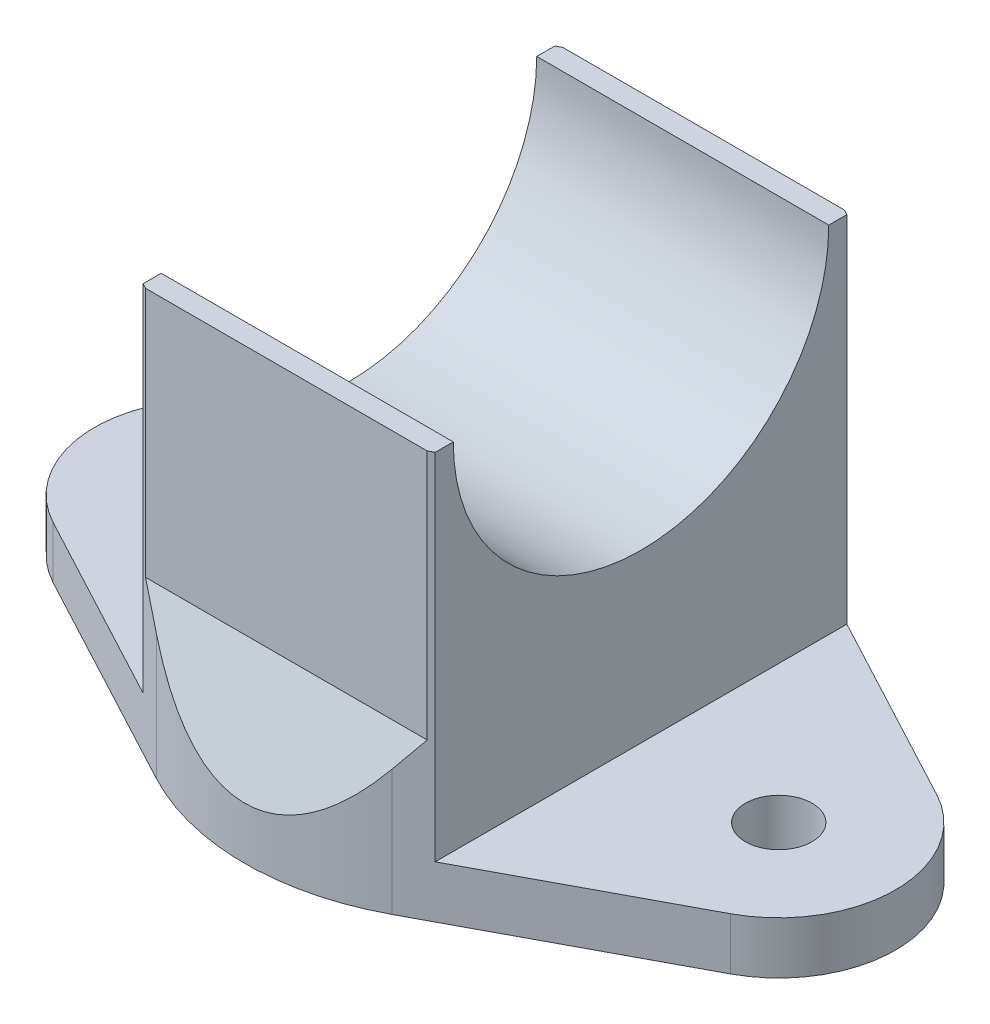
ISO-10303-21;
HEADER;
FILE_DESCRIPTION(('STEP AP214'),'2;1');
FILE_NAME('part.step','',(''),(''),'','','');
FILE_SCHEMA(('AUTOMOTIVE_DESIGN { 1 0 10303 214 1 1 1 1 }'));
ENDSEC;
DATA;
#1=APPLICATION_CONTEXT('core data for automotive mechanical design processes');
#2=APPLICATION_PROTOCOL_DEFINITION('international standard','automotive_design',2000,#1);
#3=PRODUCT_CONTEXT('',#1,'mechanical');
#4=PRODUCT('Part','Part','',(#3));
#5=PRODUCT_RELATED_PRODUCT_CATEGORY('part','',(#4));
#6=PRODUCT_DEFINITION_FORMATION('','',#4);
#7=PRODUCT_DEFINITION_CONTEXT('part definition',#1,'design');
#8=PRODUCT_DEFINITION('design','',#6,#7);
#9=PRODUCT_DEFINITION_SHAPE('','',#8);
#10=(LENGTH_UNIT() NAMED_UNIT(*) SI_UNIT(.MILLI.,.METRE.));
#11=(NAMED_UNIT(*) PLANE_ANGLE_UNIT() SI_UNIT($,.RADIAN.));
#12=(NAMED_UNIT(*) SI_UNIT($,.STERADIAN.) SOLID_ANGLE_UNIT());
#13=UNCERTAINTY_MEASURE_WITH_UNIT(LENGTH_MEASURE(1.E-05),#10,'distance_accuracy_value','');
#14=(GEOMETRIC_REPRESENTATION_CONTEXT(3) GLOBAL_UNCERTAINTY_ASSIGNED_CONTEXT((#13)) GLOBAL_UNIT_ASSIGNED_CONTEXT((#10,
#11,#12)) REPRESENTATION_CONTEXT('',''));
#15=CARTESIAN_POINT('',(0.,0.,0.));
#16=DIRECTION('',(0.,0.,1.));
#17=DIRECTION('',(1.,0.,0.));
#18=AXIS2_PLACEMENT_3D('',#15,#16,#17);
#19=CARTESIAN_POINT('',(-7.,17.,10.));
#20=DIRECTION('',(0.,1.,0.));
#21=DIRECTION('',(0.,0.,1.));
#22=AXIS2_PLACEMENT_3D('',#19,#20,#21);
#23=PLANE('',#22);
#24=DIRECTION('',(0.,0.,1.));
#25=VECTOR('',#24,1.);
#26=CARTESIAN_POINT('',(-7.,17.,10.));
#27=LINE('',#26,#25);
#28=CARTESIAN_POINT('',(-7.,17.,-9.86666666666666));
#29=VERTEX_POINT('',#28);
#30=CARTESIAN_POINT('',(-7.,17.,-9.));
#31=VERTEX_POINT('',#30);
#32=EDGE_CURVE('E169',#29,#31,#27,.T.);
#33=ORIENTED_EDGE('',*,*,#32,.T.);
#34=DIRECTION('',(-1.,0.,0.));
#35=VECTOR('',#34,1.);
#36=CARTESIAN_POINT('',(10.,17.,-9.));
#37=LINE('',#36,#35);
#38=CARTESIAN_POINT('',(7.,17.,-9.));
#39=VERTEX_POINT('',#38);
#40=EDGE_CURVE('E158',#31,#39,#37,.F.);
#41=ORIENTED_EDGE('',*,*,#40,.T.);
#42=DIRECTION('',(0.,0.,1.));
#43=VECTOR('',#42,1.);
#44=CARTESIAN_POINT('',(7.,17.,10.));
#45=LINE('',#44,#43);
#46=CARTESIAN_POINT('',(7.,17.,-9.86666666666666));
#47=VERTEX_POINT('',#46);
#48=EDGE_CURVE('E166',#47,#39,#45,.T.);
#49=ORIENTED_EDGE('',*,*,#48,.F.);
#50=DIRECTION('',(-0.882352941176471,0.,-0.470588235294118));
#51=VECTOR('',#50,1.);
#52=CARTESIAN_POINT('',(16.2352941176471,17.,-4.94117647058823));
#53=LINE('',#52,#51);
#54=CARTESIAN_POINT('',(6.74999999999999,17.,-10.));
#55=VERTEX_POINT('',#54);
#56=EDGE_CURVE('E57',#47,#55,#53,.T.);
#57=ORIENTED_EDGE('',*,*,#56,.T.);
#58=DIRECTION('',(1.,0.,0.));
#59=VECTOR('',#58,1.);
#60=CARTESIAN_POINT('',(-7.,17.,-10.));
#61=LINE('',#60,#59);
#62=CARTESIAN_POINT('',(-6.74999999999999,17.,-10.));
#63=VERTEX_POINT('',#62);
#64=EDGE_CURVE('E197',#63,#55,#61,.T.);
#65=ORIENTED_EDGE('',*,*,#64,.F.);
#66=DIRECTION('',(-0.882352941176471,0.,0.470588235294118));
#67=VECTOR('',#66,1.);
#68=CARTESIAN_POINT('',(-5.64705882352941,17.,-10.5882352941176));
#69=LINE('',#68,#67);
#70=EDGE_CURVE('E336',#63,#29,#69,.T.);
#71=ORIENTED_EDGE('',*,*,#70,.T.);
#72=EDGE_LOOP('',(#33,#41,#49,#57,#65,#71));
#73=FACE_BOUND('',#72,.T.);
#74=ADVANCED_FACE('F35',(#73),#23,.T.);
#75=CARTESIAN_POINT('',(7.,17.,9.));
#76=VERTEX_POINT('',#75);
#77=CARTESIAN_POINT('',(7.,17.,9.86666666666667));
#78=VERTEX_POINT('',#77);
#79=EDGE_CURVE('E176',#76,#78,#45,.T.);
#80=ORIENTED_EDGE('',*,*,#79,.F.);
#81=DIRECTION('',(-1.,0.,0.));
#82=VECTOR('',#81,1.);
#83=CARTESIAN_POINT('',(10.,17.,9.));
#84=LINE('',#83,#82);
#85=CARTESIAN_POINT('',(-7.,17.,9.));
#86=VERTEX_POINT('',#85);
#87=EDGE_CURVE('E49',#76,#86,#84,.T.);
#88=ORIENTED_EDGE('',*,*,#87,.T.);
#89=CARTESIAN_POINT('',(-7.,17.,9.86666666666667));
#90=VERTEX_POINT('',#89);
#91=EDGE_CURVE('E175',#86,#90,#27,.T.);
#92=ORIENTED_EDGE('',*,*,#91,.T.);
#93=DIRECTION('',(0.882352941176471,0.,0.470588235294118));
#94=VECTOR('',#93,1.);
#95=CARTESIAN_POINT('',(-16.2352941176471,17.,4.94117647058824));
#96=LINE('',#95,#94);
#97=CARTESIAN_POINT('',(-6.75,17.,10.));
#98=VERTEX_POINT('',#97);
#99=EDGE_CURVE('E316',#90,#98,#96,.T.);
#100=ORIENTED_EDGE('',*,*,#99,.T.);
#101=DIRECTION('',(1.,0.,0.));
#102=VECTOR('',#101,1.);
#103=CARTESIAN_POINT('',(-7.,17.,10.));
#104=LINE('',#103,#102);
#105=CARTESIAN_POINT('',(6.75,17.,10.));
#106=VERTEX_POINT('',#105);
#107=EDGE_CURVE('E194',#98,#106,#104,.T.);
#108=ORIENTED_EDGE('',*,*,#107,.T.);
#109=DIRECTION('',(0.882352941176471,0.,-0.470588235294116));
#110=VECTOR('',#109,1.);
#111=CARTESIAN_POINT('',(5.64705882352941,17.,10.5882352941176));
#112=LINE('',#111,#110);
#113=EDGE_CURVE('E340',#106,#78,#112,.T.);
#114=ORIENTED_EDGE('',*,*,#113,.T.);
#115=EDGE_LOOP('',(#80,#88,#92,#100,#108,#114));
#116=FACE_BOUND('',#115,.T.);
#117=ADVANCED_FACE('F333',(#116),#23,.T.);
#118=CARTESIAN_POINT('',(-7.,5.,10.));
#119=DIRECTION('',(0.,0.371390676354103,0.928476690885259));
#120=DIRECTION('',(0.,-0.928476690885259,0.371390676354103));
#121=AXIS2_PLACEMENT_3D('',#118,#119,#120);
#122=PLANE('',#121);
#123=DIRECTION('',(-0.571454488319594,-0.76193931775946,0.304775727103784));
#124=VECTOR('',#123,1.);
#125=CARTESIAN_POINT('',(2.25979680696662,-0.986937590711177,12.3947750362845));
#126=LINE('',#125,#124);
#127=CARTESIAN_POINT('',(6.75,5.,10.));
#128=VERTEX_POINT('',#127);
#129=CARTESIAN_POINT('',(5.64705882352941,3.52941176470588,10.5882352941176));
#130=VERTEX_POINT('',#129);
#131=EDGE_CURVE('E295',#128,#130,#126,.T.);
#132=ORIENTED_EDGE('',*,*,#131,.F.);
#133=DIRECTION('',(1.,0.,0.));
#134=VECTOR('',#133,1.);
#135=CARTESIAN_POINT('',(-7.,5.,10.));
#136=LINE('',#135,#134);
#137=CARTESIAN_POINT('',(-6.75,5.,10.));
#138=VERTEX_POINT('',#137);
#139=EDGE_CURVE('E190',#138,#128,#136,.T.);
#140=ORIENTED_EDGE('',*,*,#139,.F.);
#141=DIRECTION('',(-0.571454488319597,0.761939317759458,-0.304775727103783));
#142=VECTOR('',#141,1.);
#143=CARTESIAN_POINT('',(-6.83164005805515,5.1088534107402,9.95645863570392));
#144=LINE('',#143,#142);
#145=CARTESIAN_POINT('',(-5.64705882352941,3.52941176470588,10.5882352941176));
#146=VERTEX_POINT('',#145);
#147=EDGE_CURVE('E286',#146,#138,#144,.T.);
#148=ORIENTED_EDGE('',*,*,#147,.F.);
#149=CARTESIAN_POINT('',(0.,30.,0.));
#150=DIRECTION('',(0.,0.371390676354103,0.928476690885259));
#151=DIRECTION('',(0.,-0.928476690885259,0.371390676354103));
#152=AXIS2_PLACEMENT_3D('',#149,#150,#151);
#153=ELLIPSE('',#152,32.310988842807,12.);
#154=EDGE_CURVE('E43',#130,#146,#153,.F.);
#155=ORIENTED_EDGE('',*,*,#154,.F.);
#156=EDGE_LOOP('',(#132,#140,#148,#155));
#157=FACE_BOUND('',#156,.T.);
#158=ADVANCED_FACE('F287',(#157),#122,.T.);
#159=CARTESIAN_POINT('',(-13.6,0.,0.));
#160=DIRECTION('',(0.,1.,0.));
#161=DIRECTION('',(0.,0.,1.));
#162=AXIS2_PLACEMENT_3D('',#159,#160,#161);
#163=PLANE('',#162);
#164=CARTESIAN_POINT('',(-13.6,0.,0.));
#165=DIRECTION('',(0.,1.,0.));
#166=DIRECTION('',(0.,0.,1.));
#167=AXIS2_PLACEMENT_3D('',#164,#165,#166);
#168=CIRCLE('',#167,1.6);
#169=CARTESIAN_POINT('',(-13.6,0.,1.6));
#170=VERTEX_POINT('',#169);
#171=EDGE_CURVE('E205',#170,#170,#168,.T.);
#172=ORIENTED_EDGE('',*,*,#171,.F.);
#173=EDGE_LOOP('',(#172));
#174=FACE_BOUND('',#173,.T.);
#175=DIRECTION('',(0.882352941176471,0.,0.470588235294117));
#176=VECTOR('',#175,1.);
#177=CARTESIAN_POINT('',(-16.2352941176471,0.,4.94117647058824));
#178=LINE('',#177,#176);
#179=CARTESIAN_POINT('',(-16.2352941176471,0.,4.94117647058824));
#180=VERTEX_POINT('',#179);
#181=CARTESIAN_POINT('',(-7.,0.,9.86666666666667));
#182=VERTEX_POINT('',#181);
#183=EDGE_CURVE('E242',#180,#182,#178,.T.);
#184=ORIENTED_EDGE('',*,*,#183,.T.);
#185=DIRECTION('',(0.,0.,-1.));
#186=VECTOR('',#185,1.);
#187=CARTESIAN_POINT('',(-7.,0.,-12.));
#188=LINE('',#187,#186);
#189=CARTESIAN_POINT('',(-7.,0.,-9.86666666666666));
#190=VERTEX_POINT('',#189);
#191=EDGE_CURVE('E184',#182,#190,#188,.T.);
#192=ORIENTED_EDGE('',*,*,#191,.T.);
#193=DIRECTION('',(-0.88235294117647,0.,0.470588235294118));
#194=VECTOR('',#193,1.);
#195=CARTESIAN_POINT('',(-16.2352941176471,0.,-4.94117647058823));
#196=LINE('',#195,#194);
#197=CARTESIAN_POINT('',(-16.2352941176471,0.,-4.94117647058823));
#198=VERTEX_POINT('',#197);
#199=EDGE_CURVE('E218',#190,#198,#196,.T.);
#200=ORIENTED_EDGE('',*,*,#199,.T.);
#201=CARTESIAN_POINT('',(-13.6,0.,0.));
#202=DIRECTION('',(0.,1.,0.));
#203=DIRECTION('',(0.,0.,1.));
#204=AXIS2_PLACEMENT_3D('',#201,#202,#203);
#205=CIRCLE('',#204,5.6);
#206=EDGE_CURVE('E211',#198,#180,#205,.T.);
#207=ORIENTED_EDGE('',*,*,#206,.T.);
#208=EDGE_LOOP('',(#184,#192,#200,#207));
#209=FACE_BOUND('',#208,.T.);
#210=ADVANCED_FACE('F349',(#174,#209),#163,.T.);
#211=CARTESIAN_POINT('',(-13.6,-2.5,0.));
#212=DIRECTION('',(0.,1.,0.));
#213=DIRECTION('',(0.,0.,1.));
#214=AXIS2_PLACEMENT_3D('',#211,#212,#213);
#215=CYLINDRICAL_SURFACE('',#214,5.6);
#216=ORIENTED_EDGE('',*,*,#206,.F.);
#217=DIRECTION('',(0.,1.,0.));
#218=VECTOR('',#217,1.);
#219=CARTESIAN_POINT('',(-16.2352941176471,-2.5,-4.94117647058823));
#220=LINE('',#219,#218);
#221=CARTESIAN_POINT('',(-16.2352941176471,-2.5,-4.94117647058823));
#222=VERTEX_POINT('',#221);
#223=EDGE_CURVE('E189',#222,#198,#220,.T.);
#224=ORIENTED_EDGE('',*,*,#223,.F.);
#225=CARTESIAN_POINT('',(-13.6,-2.5,0.));
#226=DIRECTION('',(0.,1.,0.));
#227=DIRECTION('',(0.,0.,1.));
#228=AXIS2_PLACEMENT_3D('',#225,#226,#227);
#229=CIRCLE('',#228,5.6);
#230=CARTESIAN_POINT('',(-16.2352941176471,-2.5,4.94117647058824));
#231=VERTEX_POINT('',#230);
#232=EDGE_CURVE('E214',#222,#231,#229,.T.);
#233=ORIENTED_EDGE('',*,*,#232,.T.);
#234=DIRECTION('',(0.,1.,0.));
#235=VECTOR('',#234,1.);
#236=CARTESIAN_POINT('',(-16.2352941176471,-2.5,4.94117647058824));
#237=LINE('',#236,#235);
#238=EDGE_CURVE('E239',#231,#180,#237,.T.);
#239=ORIENTED_EDGE('',*,*,#238,.T.);
#240=EDGE_LOOP('',(#216,#224,#233,#239));
#241=FACE_BOUND('',#240,.T.);
#242=ADVANCED_FACE('F37',(#241),#215,.T.);
#243=CARTESIAN_POINT('',(-16.2352941176471,-2.5,-4.94117647058823));
#244=DIRECTION('',(-0.470588235294118,0.,-0.882352941176471));
#245=DIRECTION('',(-0.882352941176471,0.,0.470588235294118));
#246=AXIS2_PLACEMENT_3D('',#243,#244,#245);
#247=PLANE('',#246);
#248=ORIENTED_EDGE('',*,*,#199,.F.);
#249=DIRECTION('',(0.,1.,0.));
#250=VECTOR('',#249,1.);
#251=CARTESIAN_POINT('',(-7.,0.,-9.86666666666666));
#252=LINE('',#251,#250);
#253=EDGE_CURVE('E275',#190,#29,#252,.T.);
#254=ORIENTED_EDGE('',*,*,#253,.T.);
#255=ORIENTED_EDGE('',*,*,#70,.F.);
#256=DIRECTION('',(0.,-1.,0.));
#257=VECTOR('',#256,1.);
#258=CARTESIAN_POINT('',(-6.74999999999999,5.,-10.));
#259=LINE('',#258,#257);
#260=CARTESIAN_POINT('',(-6.74999999999999,5.,-10.));
#261=VERTEX_POINT('',#260);
#262=EDGE_CURVE('E290',#63,#261,#259,.T.);
#263=ORIENTED_EDGE('',*,*,#262,.T.);
#264=DIRECTION('',(0.571454488319594,-0.76193931775946,-0.304775727103784));
#265=VECTOR('',#264,1.);
#266=CARTESIAN_POINT('',(-6.83164005805515,5.10885341074021,-9.95645863570392));
#267=LINE('',#266,#265);
#268=CARTESIAN_POINT('',(-5.64705882352941,3.52941176470589,-10.5882352941176));
#269=VERTEX_POINT('',#268);
#270=EDGE_CURVE('E293',#261,#269,#267,.T.);
#271=ORIENTED_EDGE('',*,*,#270,.T.);
#272=DIRECTION('',(0.,1.,0.));
#273=VECTOR('',#272,1.);
#274=CARTESIAN_POINT('',(-5.64705882352941,-2.5,-10.5882352941176));
#275=LINE('',#274,#273);
#276=CARTESIAN_POINT('',(-5.64705882352941,-2.5,-10.5882352941176));
#277=VERTEX_POINT('',#276);
#278=EDGE_CURVE('E256',#277,#269,#275,.T.);
#279=ORIENTED_EDGE('',*,*,#278,.F.);
#280=DIRECTION('',(-0.88235294117647,0.,0.470588235294118));
#281=VECTOR('',#280,1.);
#282=CARTESIAN_POINT('',(-16.2352941176471,-2.5,-4.94117647058823));
#283=LINE('',#282,#281);
#284=EDGE_CURVE('E236',#277,#222,#283,.T.);
#285=ORIENTED_EDGE('',*,*,#284,.T.);
#286=ORIENTED_EDGE('',*,*,#223,.T.);
#287=EDGE_LOOP('',(#248,#254,#255,#263,#271,#279,#285,#286));
#288=FACE_BOUND('',#287,.T.);
#289=ADVANCED_FACE('F356',(#288),#247,.T.);
#290=CARTESIAN_POINT('',(0.,-2.5,0.));
#291=DIRECTION('',(0.,1.,0.));
#292=DIRECTION('',(0.,0.,1.));
#293=AXIS2_PLACEMENT_3D('',#290,#291,#292);
#294=CYLINDRICAL_SURFACE('',#293,12.);
#295=CARTESIAN_POINT('',(0.,30.,0.));
#296=DIRECTION('',(0.,0.371390676354103,-0.928476690885259));
#297=DIRECTION('',(0.,-0.928476690885259,-0.371390676354103));
#298=AXIS2_PLACEMENT_3D('',#295,#296,#297);
#299=ELLIPSE('',#298,32.310988842807,12.);
#300=CARTESIAN_POINT('',(5.64705882352941,3.52941176470588,-10.5882352941176));
#301=VERTEX_POINT('',#300);
#302=EDGE_CURVE('E179',#269,#301,#299,.F.);
#303=ORIENTED_EDGE('',*,*,#302,.T.);
#304=DIRECTION('',(0.,1.,0.));
#305=VECTOR('',#304,1.);
#306=CARTESIAN_POINT('',(5.64705882352941,-2.5,-10.5882352941176));
#307=LINE('',#306,#305);
#308=CARTESIAN_POINT('',(5.64705882352941,-2.5,-10.5882352941176));
#309=VERTEX_POINT('',#308);
#310=EDGE_CURVE('E258',#309,#301,#307,.T.);
#311=ORIENTED_EDGE('',*,*,#310,.F.);
#312=CARTESIAN_POINT('',(0.,-2.5,0.));
#313=DIRECTION('',(0.,1.,0.));
#314=DIRECTION('',(0.,0.,1.));
#315=AXIS2_PLACEMENT_3D('',#312,#313,#314);
#316=CIRCLE('',#315,12.);
#317=EDGE_CURVE('E233',#309,#277,#316,.T.);
#318=ORIENTED_EDGE('',*,*,#317,.T.);
#319=ORIENTED_EDGE('',*,*,#278,.T.);
#320=EDGE_LOOP('',(#303,#311,#318,#319));
#321=FACE_BOUND('',#320,.T.);
#322=ADVANCED_FACE('F305',(#321),#294,.T.);
#323=CARTESIAN_POINT('',(16.2352941176471,-2.5,-4.94117647058823));
#324=DIRECTION('',(0.470588235294118,0.,-0.882352941176471));
#325=DIRECTION('',(-0.882352941176471,0.,-0.470588235294118));
#326=AXIS2_PLACEMENT_3D('',#323,#324,#325);
#327=PLANE('',#326);
#328=DIRECTION('',(-0.88235294117647,0.,-0.470588235294118));
#329=VECTOR('',#328,1.);
#330=CARTESIAN_POINT('',(16.2352941176471,0.,-4.94117647058823));
#331=LINE('',#330,#329);
#332=CARTESIAN_POINT('',(16.2352941176471,0.,-4.94117647058823));
#333=VERTEX_POINT('',#332);
#334=CARTESIAN_POINT('',(7.,0.,-9.86666666666666));
#335=VERTEX_POINT('',#334);
#336=EDGE_CURVE('E250',#333,#335,#331,.T.);
#337=ORIENTED_EDGE('',*,*,#336,.F.);
#338=DIRECTION('',(0.,1.,0.));
#339=VECTOR('',#338,1.);
#340=CARTESIAN_POINT('',(16.2352941176471,-2.5,-4.94117647058823));
#341=LINE('',#340,#339);
#342=CARTESIAN_POINT('',(16.2352941176471,-2.5,-4.94117647058823));
#343=VERTEX_POINT('',#342);
#344=EDGE_CURVE('E260',#343,#333,#341,.T.);
#345=ORIENTED_EDGE('',*,*,#344,.F.);
#346=DIRECTION('',(-0.88235294117647,0.,-0.470588235294118));
#347=VECTOR('',#346,1.);
#348=CARTESIAN_POINT('',(16.2352941176471,-2.5,-4.94117647058823));
#349=LINE('',#348,#347);
#350=EDGE_CURVE('E230',#343,#309,#349,.T.);
#351=ORIENTED_EDGE('',*,*,#350,.T.);
#352=ORIENTED_EDGE('',*,*,#310,.T.);
#353=DIRECTION('',(0.571454488319594,0.76193931775946,0.304775727103784));
#354=VECTOR('',#353,1.);
#355=CARTESIAN_POINT('',(2.25979680696662,-0.986937590711172,-12.3947750362845));
#356=LINE('',#355,#354);
#357=CARTESIAN_POINT('',(6.74999999999999,5.,-10.));
#358=VERTEX_POINT('',#357);
#359=EDGE_CURVE('E308',#301,#358,#356,.T.);
#360=ORIENTED_EDGE('',*,*,#359,.T.);
#361=DIRECTION('',(0.,1.,0.));
#362=VECTOR('',#361,1.);
#363=CARTESIAN_POINT('',(6.74999999999999,5.,-10.));
#364=LINE('',#363,#362);
#365=EDGE_CURVE('E313',#358,#55,#364,.T.);
#366=ORIENTED_EDGE('',*,*,#365,.T.);
#367=ORIENTED_EDGE('',*,*,#56,.F.);
#368=DIRECTION('',(0.,1.,0.));
#369=VECTOR('',#368,1.);
#370=CARTESIAN_POINT('',(7.,0.,-9.86666666666666));
#371=LINE('',#370,#369);
#372=EDGE_CURVE('E174',#335,#47,#371,.T.);
#373=ORIENTED_EDGE('',*,*,#372,.F.);
#374=EDGE_LOOP('',(#337,#345,#351,#352,#360,#366,#367,#373));
#375=FACE_BOUND('',#374,.T.);
#376=ADVANCED_FACE('F360',(#375),#327,.T.);
#377=CARTESIAN_POINT('',(13.6,-2.5,0.));
#378=DIRECTION('',(0.,1.,0.));
#379=DIRECTION('',(0.,0.,1.));
#380=AXIS2_PLACEMENT_3D('',#377,#378,#379);
#381=CYLINDRICAL_SURFACE('',#380,5.6);
#382=CARTESIAN_POINT('',(13.6,0.,0.));
#383=DIRECTION('',(0.,1.,0.));
#384=DIRECTION('',(0.,0.,1.));
#385=AXIS2_PLACEMENT_3D('',#382,#383,#384);
#386=CIRCLE('',#385,5.6);
#387=CARTESIAN_POINT('',(16.2352941176471,0.,4.94117647058824));
#388=VERTEX_POINT('',#387);
#389=EDGE_CURVE('E247',#388,#333,#386,.T.);
#390=ORIENTED_EDGE('',*,*,#389,.F.);
#391=DIRECTION('',(0.,1.,0.));
#392=VECTOR('',#391,1.);
#393=CARTESIAN_POINT('',(16.2352941176471,-2.5,4.94117647058824));
#394=LINE('',#393,#392);
#395=CARTESIAN_POINT('',(16.2352941176471,-2.5,4.94117647058824));
#396=VERTEX_POINT('',#395);
#397=EDGE_CURVE('E262',#396,#388,#394,.T.);
#398=ORIENTED_EDGE('',*,*,#397,.F.);
#399=CARTESIAN_POINT('',(13.6,-2.5,0.));
#400=DIRECTION('',(0.,1.,0.));
#401=DIRECTION('',(0.,0.,1.));
#402=AXIS2_PLACEMENT_3D('',#399,#400,#401);
#403=CIRCLE('',#402,5.6);
#404=EDGE_CURVE('E227',#396,#343,#403,.T.);
#405=ORIENTED_EDGE('',*,*,#404,.T.);
#406=ORIENTED_EDGE('',*,*,#344,.T.);
#407=EDGE_LOOP('',(#390,#398,#405,#406));
#408=FACE_BOUND('',#407,.T.);
#409=ADVANCED_FACE('F363',(#408),#381,.T.);
#410=CARTESIAN_POINT('',(16.2352941176471,-2.5,4.94117647058824));
#411=DIRECTION('',(0.470588235294117,0.,0.882352941176471));
#412=DIRECTION('',(0.882352941176471,0.,-0.470588235294117));
#413=AXIS2_PLACEMENT_3D('',#410,#411,#412);
#414=PLANE('',#413);
#415=DIRECTION('',(0.882352941176471,0.,-0.470588235294117));
#416=VECTOR('',#415,1.);
#417=CARTESIAN_POINT('',(16.2352941176471,0.,4.94117647058824));
#418=LINE('',#417,#416);
#419=CARTESIAN_POINT('',(7.,0.,9.86666666666667));
#420=VERTEX_POINT('',#419);
#421=EDGE_CURVE('E245',#420,#388,#418,.T.);
#422=ORIENTED_EDGE('',*,*,#421,.F.);
#423=DIRECTION('',(0.,-1.,0.));
#424=VECTOR('',#423,1.);
#425=CARTESIAN_POINT('',(7.,0.,9.86666666666667));
#426=LINE('',#425,#424);
#427=EDGE_CURVE('E271',#78,#420,#426,.T.);
#428=ORIENTED_EDGE('',*,*,#427,.F.);
#429=ORIENTED_EDGE('',*,*,#113,.F.);
#430=DIRECTION('',(0.,-1.,0.));
#431=VECTOR('',#430,1.);
#432=CARTESIAN_POINT('',(6.75,5.,10.));
#433=LINE('',#432,#431);
#434=EDGE_CURVE('E312',#106,#128,#433,.T.);
#435=ORIENTED_EDGE('',*,*,#434,.T.);
#436=ORIENTED_EDGE('',*,*,#131,.T.);
#437=DIRECTION('',(0.,1.,0.));
#438=VECTOR('',#437,1.);
#439=CARTESIAN_POINT('',(5.64705882352941,-2.5,10.5882352941176));
#440=LINE('',#439,#438);
#441=CARTESIAN_POINT('',(5.64705882352941,-2.5,10.5882352941176));
#442=VERTEX_POINT('',#441);
#443=EDGE_CURVE('E265',#442,#130,#440,.T.);
#444=ORIENTED_EDGE('',*,*,#443,.F.);
#445=DIRECTION('',(0.882352941176471,0.,-0.470588235294117));
#446=VECTOR('',#445,1.);
#447=CARTESIAN_POINT('',(16.2352941176471,-2.5,4.94117647058824));
#448=LINE('',#447,#446);
#449=EDGE_CURVE('E224',#442,#396,#448,.T.);
#450=ORIENTED_EDGE('',*,*,#449,.T.);
#451=ORIENTED_EDGE('',*,*,#397,.T.);
#452=EDGE_LOOP('',(#422,#428,#429,#435,#436,#444,#450,#451));
#453=FACE_BOUND('',#452,.T.);
#454=ADVANCED_FACE('F321',(#453),#414,.T.);
#455=CARTESIAN_POINT('',(0.,-2.5,0.));
#456=DIRECTION('',(0.,1.,0.));
#457=DIRECTION('',(0.,0.,1.));
#458=AXIS2_PLACEMENT_3D('',#455,#456,#457);
#459=CYLINDRICAL_SURFACE('',#458,12.);
#460=ORIENTED_EDGE('',*,*,#154,.T.);
#461=DIRECTION('',(0.,1.,0.));
#462=VECTOR('',#461,1.);
#463=CARTESIAN_POINT('',(-5.64705882352941,-2.5,10.5882352941176));
#464=LINE('',#463,#462);
#465=CARTESIAN_POINT('',(-5.64705882352941,-2.5,10.5882352941176));
#466=VERTEX_POINT('',#465);
#467=EDGE_CURVE('E267',#466,#146,#464,.T.);
#468=ORIENTED_EDGE('',*,*,#467,.F.);
#469=CARTESIAN_POINT('',(0.,-2.5,0.));
#470=DIRECTION('',(0.,1.,0.));
#471=DIRECTION('',(0.,0.,1.));
#472=AXIS2_PLACEMENT_3D('',#469,#470,#471);
#473=CIRCLE('',#472,12.);
#474=EDGE_CURVE('E221',#466,#442,#473,.T.);
#475=ORIENTED_EDGE('',*,*,#474,.T.);
#476=ORIENTED_EDGE('',*,*,#443,.T.);
#477=EDGE_LOOP('',(#460,#468,#475,#476));
#478=FACE_BOUND('',#477,.T.);
#479=ADVANCED_FACE('F280',(#478),#459,.T.);
#480=CARTESIAN_POINT('',(-16.2352941176471,-2.5,4.94117647058824));
#481=DIRECTION('',(-0.470588235294117,0.,0.882352941176471));
#482=DIRECTION('',(0.882352941176471,0.,0.470588235294117));
#483=AXIS2_PLACEMENT_3D('',#480,#481,#482);
#484=PLANE('',#483);
#485=ORIENTED_EDGE('',*,*,#183,.F.);
#486=ORIENTED_EDGE('',*,*,#238,.F.);
#487=DIRECTION('',(0.882352941176471,0.,0.470588235294117));
#488=VECTOR('',#487,1.);
#489=CARTESIAN_POINT('',(-16.2352941176471,-2.5,4.94117647058824));
#490=LINE('',#489,#488);
#491=EDGE_CURVE('E217',#231,#466,#490,.T.);
#492=ORIENTED_EDGE('',*,*,#491,.T.);
#493=ORIENTED_EDGE('',*,*,#467,.T.);
#494=ORIENTED_EDGE('',*,*,#147,.T.);
#495=DIRECTION('',(0.,1.,0.));
#496=VECTOR('',#495,1.);
#497=CARTESIAN_POINT('',(-6.75,5.,10.));
#498=LINE('',#497,#496);
#499=EDGE_CURVE('E291',#138,#98,#498,.T.);
#500=ORIENTED_EDGE('',*,*,#499,.T.);
#501=ORIENTED_EDGE('',*,*,#99,.F.);
#502=DIRECTION('',(0.,-1.,0.));
#503=VECTOR('',#502,1.);
#504=CARTESIAN_POINT('',(-7.,0.,9.86666666666667));
#505=LINE('',#504,#503);
#506=EDGE_CURVE('E273',#90,#182,#505,.T.);
#507=ORIENTED_EDGE('',*,*,#506,.T.);
#508=EDGE_LOOP('',(#485,#486,#492,#493,#494,#500,#501,#507));
#509=FACE_BOUND('',#508,.T.);
#510=ADVANCED_FACE('F330',(#509),#484,.T.);
#511=CARTESIAN_POINT('',(-13.6,-2.5,0.));
#512=DIRECTION('',(0.,1.,0.));
#513=DIRECTION('',(0.,0.,1.));
#514=AXIS2_PLACEMENT_3D('',#511,#512,#513);
#515=PLANE('',#514);
#516=CARTESIAN_POINT('',(13.6,-2.5,0.));
#517=DIRECTION('',(0.,1.,0.));
#518=DIRECTION('',(0.,0.,1.));
#519=AXIS2_PLACEMENT_3D('',#516,#517,#518);
#520=CIRCLE('',#519,1.6);
#521=CARTESIAN_POINT('',(13.6,-2.5,1.6));
#522=VERTEX_POINT('',#521);
#523=EDGE_CURVE('E202',#522,#522,#520,.T.);
#524=ORIENTED_EDGE('',*,*,#523,.T.);
#525=EDGE_LOOP('',(#524));
#526=FACE_BOUND('',#525,.T.);
#527=CARTESIAN_POINT('',(-13.6,-2.5,0.));
#528=DIRECTION('',(0.,1.,0.));
#529=DIRECTION('',(0.,0.,1.));
#530=AXIS2_PLACEMENT_3D('',#527,#528,#529);
#531=CIRCLE('',#530,1.6);
#532=CARTESIAN_POINT('',(-13.6,-2.5,1.6));
#533=VERTEX_POINT('',#532);
#534=EDGE_CURVE('E208',#533,#533,#531,.T.);
#535=ORIENTED_EDGE('',*,*,#534,.T.);
#536=EDGE_LOOP('',(#535));
#537=FACE_BOUND('',#536,.T.);
#538=ORIENTED_EDGE('',*,*,#232,.F.);
#539=ORIENTED_EDGE('',*,*,#284,.F.);
#540=ORIENTED_EDGE('',*,*,#317,.F.);
#541=ORIENTED_EDGE('',*,*,#350,.F.);
#542=ORIENTED_EDGE('',*,*,#404,.F.);
#543=ORIENTED_EDGE('',*,*,#449,.F.);
#544=ORIENTED_EDGE('',*,*,#474,.F.);
#545=ORIENTED_EDGE('',*,*,#491,.F.);
#546=EDGE_LOOP('',(#538,#539,#540,#541,#542,#543,#544,#545));
#547=FACE_BOUND('',#546,.T.);
#548=ADVANCED_FACE('F355',(#526,#537,#547),#515,.F.);
#549=DIRECTION('',(0.,0.,-1.));
#550=VECTOR('',#549,1.);
#551=CARTESIAN_POINT('',(7.,0.,-12.));
#552=LINE('',#551,#550);
#553=EDGE_CURVE('E183',#420,#335,#552,.T.);
#554=ORIENTED_EDGE('',*,*,#553,.F.);
#555=ORIENTED_EDGE('',*,*,#421,.T.);
#556=ORIENTED_EDGE('',*,*,#389,.T.);
#557=ORIENTED_EDGE('',*,*,#336,.T.);
#558=EDGE_LOOP('',(#554,#555,#556,#557));
#559=FACE_BOUND('',#558,.T.);
#560=CARTESIAN_POINT('',(13.6,0.,0.));
#561=DIRECTION('',(0.,1.,0.));
#562=DIRECTION('',(0.,0.,1.));
#563=AXIS2_PLACEMENT_3D('',#560,#561,#562);
#564=CIRCLE('',#563,1.6);
#565=CARTESIAN_POINT('',(13.6,0.,1.6));
#566=VERTEX_POINT('',#565);
#567=EDGE_CURVE('E193',#566,#566,#564,.T.);
#568=ORIENTED_EDGE('',*,*,#567,.F.);
#569=EDGE_LOOP('',(#568));
#570=FACE_BOUND('',#569,.T.);
#571=ADVANCED_FACE('F367',(#559,#570),#163,.T.);
#572=CARTESIAN_POINT('',(-13.6,-2.5,0.));
#573=DIRECTION('',(0.,1.,0.));
#574=DIRECTION('',(0.,0.,1.));
#575=AXIS2_PLACEMENT_3D('',#572,#573,#574);
#576=CYLINDRICAL_SURFACE('',#575,1.6);
#577=ORIENTED_EDGE('',*,*,#534,.F.);
#578=EDGE_LOOP('',(#577));
#579=FACE_BOUND('',#578,.T.);
#580=ORIENTED_EDGE('',*,*,#171,.T.);
#581=EDGE_LOOP('',(#580));
#582=FACE_BOUND('',#581,.T.);
#583=ADVANCED_FACE('F370',(#579,#582),#576,.F.);
#584=CARTESIAN_POINT('',(13.6,-2.5,0.));
#585=DIRECTION('',(0.,1.,0.));
#586=DIRECTION('',(0.,0.,1.));
#587=AXIS2_PLACEMENT_3D('',#584,#585,#586);
#588=CYLINDRICAL_SURFACE('',#587,1.6);
#589=ORIENTED_EDGE('',*,*,#523,.F.);
#590=EDGE_LOOP('',(#589));
#591=FACE_BOUND('',#590,.T.);
#592=ORIENTED_EDGE('',*,*,#567,.T.);
#593=EDGE_LOOP('',(#592));
#594=FACE_BOUND('',#593,.T.);
#595=ADVANCED_FACE('F374',(#591,#594),#588,.F.);
#596=CARTESIAN_POINT('',(-7.,5.,-10.));
#597=DIRECTION('',(0.,0.371390676354103,-0.928476690885259));
#598=DIRECTION('',(0.,0.928476690885259,0.371390676354103));
#599=AXIS2_PLACEMENT_3D('',#596,#597,#598);
#600=PLANE('',#599);
#601=ORIENTED_EDGE('',*,*,#359,.F.);
#602=ORIENTED_EDGE('',*,*,#302,.F.);
#603=ORIENTED_EDGE('',*,*,#270,.F.);
#604=DIRECTION('',(1.,0.,0.));
#605=VECTOR('',#604,1.);
#606=CARTESIAN_POINT('',(-7.,5.,-10.));
#607=LINE('',#606,#605);
#608=EDGE_CURVE('E186',#261,#358,#607,.T.);
#609=ORIENTED_EDGE('',*,*,#608,.T.);
#610=EDGE_LOOP('',(#601,#602,#603,#609));
#611=FACE_BOUND('',#610,.T.);
#612=ADVANCED_FACE('F309',(#611),#600,.T.);
#613=CARTESIAN_POINT('',(-7.,5.,10.));
#614=DIRECTION('',(0.,0.,1.));
#615=DIRECTION('',(1.,0.,0.));
#616=AXIS2_PLACEMENT_3D('',#613,#614,#615);
#617=PLANE('',#616);
#618=ORIENTED_EDGE('',*,*,#434,.F.);
#619=ORIENTED_EDGE('',*,*,#107,.F.);
#620=ORIENTED_EDGE('',*,*,#499,.F.);
#621=ORIENTED_EDGE('',*,*,#139,.T.);
#622=EDGE_LOOP('',(#618,#619,#620,#621));
#623=FACE_BOUND('',#622,.T.);
#624=ADVANCED_FACE('F325',(#623),#617,.T.);
#625=CARTESIAN_POINT('',(-7.,5.,-10.));
#626=DIRECTION('',(0.,0.,-1.));
#627=DIRECTION('',(-1.,0.,0.));
#628=AXIS2_PLACEMENT_3D('',#625,#626,#627);
#629=PLANE('',#628);
#630=ORIENTED_EDGE('',*,*,#365,.F.);
#631=ORIENTED_EDGE('',*,*,#608,.F.);
#632=ORIENTED_EDGE('',*,*,#262,.F.);
#633=ORIENTED_EDGE('',*,*,#64,.T.);
#634=EDGE_LOOP('',(#630,#631,#632,#633));
#635=FACE_BOUND('',#634,.T.);
#636=ADVANCED_FACE('F394',(#635),#629,.T.);
#637=CARTESIAN_POINT('',(-7.,0.,0.));
#638=DIRECTION('',(-1.,0.,0.));
#639=DIRECTION('',(0.,0.,1.));
#640=AXIS2_PLACEMENT_3D('',#637,#638,#639);
#641=PLANE('',#640);
#642=ORIENTED_EDGE('',*,*,#91,.F.);
#643=CARTESIAN_POINT('',(-7.,17.,0.));
#644=DIRECTION('',(-1.,0.,0.));
#645=DIRECTION('',(0.,0.,1.));
#646=AXIS2_PLACEMENT_3D('',#643,#644,#645);
#647=CIRCLE('',#646,9.);
#648=EDGE_CURVE('E170',#86,#31,#647,.F.);
#649=ORIENTED_EDGE('',*,*,#648,.T.);
#650=ORIENTED_EDGE('',*,*,#32,.F.);
#651=ORIENTED_EDGE('',*,*,#253,.F.);
#652=ORIENTED_EDGE('',*,*,#191,.F.);
#653=ORIENTED_EDGE('',*,*,#506,.F.);
#654=EDGE_LOOP('',(#642,#649,#650,#651,#652,#653));
#655=FACE_BOUND('',#654,.T.);
#656=ADVANCED_FACE('F344',(#655),#641,.T.);
#657=CARTESIAN_POINT('',(7.,0.,0.));
#658=DIRECTION('',(-1.,0.,0.));
#659=DIRECTION('',(0.,0.,1.));
#660=AXIS2_PLACEMENT_3D('',#657,#658,#659);
#661=PLANE('',#660);
#662=CARTESIAN_POINT('',(7.,17.,0.));
#663=DIRECTION('',(-1.,0.,0.));
#664=DIRECTION('',(0.,0.,1.));
#665=AXIS2_PLACEMENT_3D('',#662,#663,#664);
#666=CIRCLE('',#665,9.);
#667=EDGE_CURVE('E11',#76,#39,#666,.F.);
#668=ORIENTED_EDGE('',*,*,#667,.F.);
#669=ORIENTED_EDGE('',*,*,#79,.T.);
#670=ORIENTED_EDGE('',*,*,#427,.T.);
#671=ORIENTED_EDGE('',*,*,#553,.T.);
#672=ORIENTED_EDGE('',*,*,#372,.T.);
#673=ORIENTED_EDGE('',*,*,#48,.T.);
#674=EDGE_LOOP('',(#668,#669,#670,#671,#672,#673));
#675=FACE_BOUND('',#674,.T.);
#676=ADVANCED_FACE('F172',(#675),#661,.F.);
#677=CARTESIAN_POINT('',(10.,17.,0.));
#678=DIRECTION('',(-1.,0.,0.));
#679=DIRECTION('',(0.,0.,1.));
#680=AXIS2_PLACEMENT_3D('',#677,#678,#679);
#681=CYLINDRICAL_SURFACE('',#680,9.);
#682=ORIENTED_EDGE('',*,*,#87,.F.);
#683=ORIENTED_EDGE('',*,*,#667,.T.);
#684=ORIENTED_EDGE('',*,*,#40,.F.);
#685=ORIENTED_EDGE('',*,*,#648,.F.);
#686=EDGE_LOOP('',(#682,#683,#684,#685));
#687=FACE_BOUND('',#686,.T.);
#688=ADVANCED_FACE('F157',(#687),#681,.F.);
#689=CLOSED_SHELL('',(#74,#117,#158,#210,#242,#289,#322,#376,#409,#454,#479,#510,#548,#571,#583,
#595,#612,#624,#636,#656,#676,#688));
#690=MANIFOLD_SOLID_BREP('B2',#689);
#691=ADVANCED_BREP_SHAPE_REPRESENTATION('',(#18,#690),#14);
#692=SHAPE_DEFINITION_REPRESENTATION(#9,#691);
ENDSEC;
END-ISO-10303-21;
